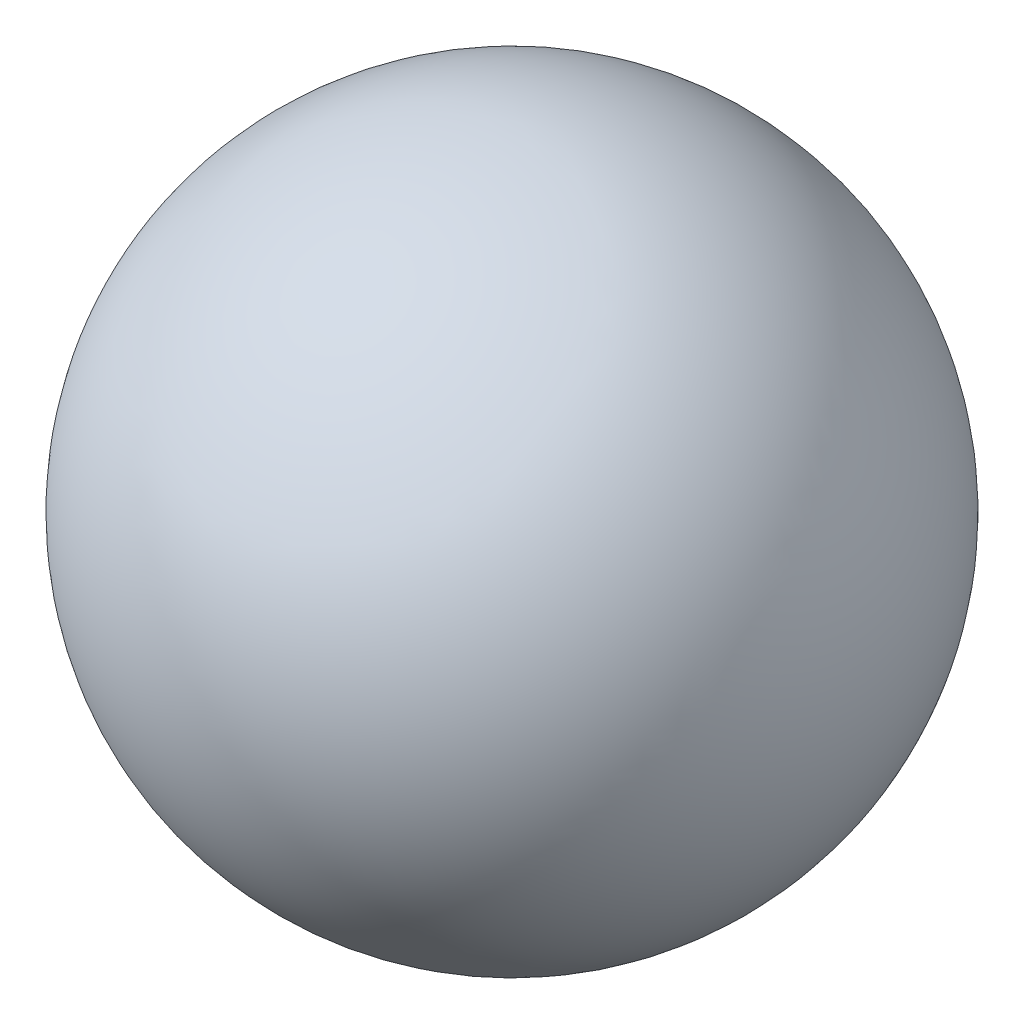
ISO-10303-21;
HEADER;
FILE_DESCRIPTION(('STEP AP214'),'2;1');
FILE_NAME('part.step','',(''),(''),'','','');
FILE_SCHEMA(('AUTOMOTIVE_DESIGN { 1 0 10303 214 1 1 1 1 }'));
ENDSEC;
DATA;
#1=APPLICATION_CONTEXT('core data for automotive mechanical design processes');
#2=APPLICATION_PROTOCOL_DEFINITION('international standard','automotive_design',2000,#1);
#3=PRODUCT_CONTEXT('',#1,'mechanical');
#4=PRODUCT('Part','Part','',(#3));
#5=PRODUCT_RELATED_PRODUCT_CATEGORY('part','',(#4));
#6=PRODUCT_DEFINITION_FORMATION('','',#4);
#7=PRODUCT_DEFINITION_CONTEXT('part definition',#1,'design');
#8=PRODUCT_DEFINITION('design','',#6,#7);
#9=PRODUCT_DEFINITION_SHAPE('','',#8);
#10=(LENGTH_UNIT() NAMED_UNIT(*) SI_UNIT(.MILLI.,.METRE.));
#11=(NAMED_UNIT(*) PLANE_ANGLE_UNIT() SI_UNIT($,.RADIAN.));
#12=(NAMED_UNIT(*) SI_UNIT($,.STERADIAN.) SOLID_ANGLE_UNIT());
#13=UNCERTAINTY_MEASURE_WITH_UNIT(LENGTH_MEASURE(1.E-05),#10,'distance_accuracy_value','');
#14=(GEOMETRIC_REPRESENTATION_CONTEXT(3) GLOBAL_UNCERTAINTY_ASSIGNED_CONTEXT((#13)) GLOBAL_UNIT_ASSIGNED_CONTEXT((#10,
#11,#12)) REPRESENTATION_CONTEXT('',''));
#15=CARTESIAN_POINT('',(0.,0.,0.));
#16=DIRECTION('',(0.,0.,1.));
#17=DIRECTION('',(1.,0.,0.));
#18=AXIS2_PLACEMENT_3D('',#15,#16,#17);
#19=CARTESIAN_POINT('',(22.6274169979695,0.,0.));
#20=DIRECTION('',(-1.,0.,0.));
#21=DIRECTION('',(0.,0.,-1.));
#22=AXIS2_PLACEMENT_3D('',#19,#20,#21);
#23=SPHERICAL_SURFACE('',#22,24.);
#24=CARTESIAN_POINT('',(0.00653635972692676,0.,0.));
#25=DIRECTION('',(1.,0.,0.));
#26=DIRECTION('',(0.,0.,-1.));
#27=AXIS2_PLACEMENT_3D('',#24,#25,#26);
#28=CIRCLE('',#27,8.01846364027307);
#29=CARTESIAN_POINT('',(0.00653635972692676,0.,-8.01846364027307));
#30=VERTEX_POINT('',#29);
#31=EDGE_CURVE('E11',#30,#30,#28,.T.);
#32=ORIENTED_EDGE('',*,*,#31,.T.);
#33=EDGE_LOOP('',(#32));
#34=FACE_BOUND('',#33,.T.);
#35=ADVANCED_FACE('F40',(#34),#23,.T.);
#36=CARTESIAN_POINT('',(0.,0.,0.));
#37=DIRECTION('',(-1.,0.,0.));
#38=DIRECTION('',(0.,0.,1.));
#39=AXIS2_PLACEMENT_3D('',#36,#37,#38);
#40=CONICAL_SURFACE('',#39,8.025,0.785398163397449);
#41=CARTESIAN_POINT('',(1.02500000000001,0.,0.));
#42=DIRECTION('',(-1.,0.,0.));
#43=DIRECTION('',(0.,0.,1.));
#44=AXIS2_PLACEMENT_3D('',#41,#42,#43);
#45=CIRCLE('',#44,6.99999999999999);
#46=CARTESIAN_POINT('',(1.02500000000001,0.,6.99999999999999));
#47=VERTEX_POINT('',#46);
#48=EDGE_CURVE('E57',#47,#47,#45,.T.);
#49=ORIENTED_EDGE('',*,*,#48,.F.);
#50=EDGE_LOOP('',(#49));
#51=FACE_BOUND('',#50,.T.);
#52=ORIENTED_EDGE('',*,*,#31,.F.);
#53=EDGE_LOOP('',(#52));
#54=FACE_BOUND('',#53,.T.);
#55=ADVANCED_FACE('F53',(#51,#54),#40,.F.);
#56=CARTESIAN_POINT('',(38.,0.,0.));
#57=DIRECTION('',(-1.,0.,0.));
#58=DIRECTION('',(0.,0.,1.));
#59=AXIS2_PLACEMENT_3D('',#56,#57,#58);
#60=CONICAL_SURFACE('',#59,6.99999999999999,1.02974425867665);
#61=CARTESIAN_POINT('',(42.2060243331929,0.,0.));
#62=VERTEX_POINT('',#61);
#63=VERTEX_LOOP('',#62);
#64=FACE_BOUND('',#63,.T.);
#65=CARTESIAN_POINT('',(38.,0.,0.));
#66=DIRECTION('',(-1.,0.,0.));
#67=DIRECTION('',(0.,0.,1.));
#68=AXIS2_PLACEMENT_3D('',#65,#66,#67);
#69=CIRCLE('',#68,6.99999999999999);
#70=CARTESIAN_POINT('',(38.,0.,6.99999999999999));
#71=VERTEX_POINT('',#70);
#72=EDGE_CURVE('E46',#71,#71,#69,.T.);
#73=ORIENTED_EDGE('',*,*,#72,.T.);
#74=EDGE_LOOP('',(#73));
#75=FACE_BOUND('',#74,.T.);
#76=ADVANCED_FACE('F49',(#64,#75),#60,.F.);
#77=CARTESIAN_POINT('',(0.,0.,0.));
#78=DIRECTION('',(-1.,0.,0.));
#79=DIRECTION('',(0.,0.,1.));
#80=AXIS2_PLACEMENT_3D('',#77,#78,#79);
#81=CYLINDRICAL_SURFACE('',#80,6.99999999999999);
#82=ORIENTED_EDGE('',*,*,#72,.F.);
#83=EDGE_LOOP('',(#82));
#84=FACE_BOUND('',#83,.T.);
#85=ORIENTED_EDGE('',*,*,#48,.T.);
#86=EDGE_LOOP('',(#85));
#87=FACE_BOUND('',#86,.T.);
#88=ADVANCED_FACE('F52',(#84,#87),#81,.F.);
#89=CLOSED_SHELL('',(#35,#55,#76,#88));
#90=MANIFOLD_SOLID_BREP('B2',#89);
#91=ADVANCED_BREP_SHAPE_REPRESENTATION('',(#18,#90),#14);
#92=SHAPE_DEFINITION_REPRESENTATION(#9,#91);
ENDSEC;
END-ISO-10303-21;
